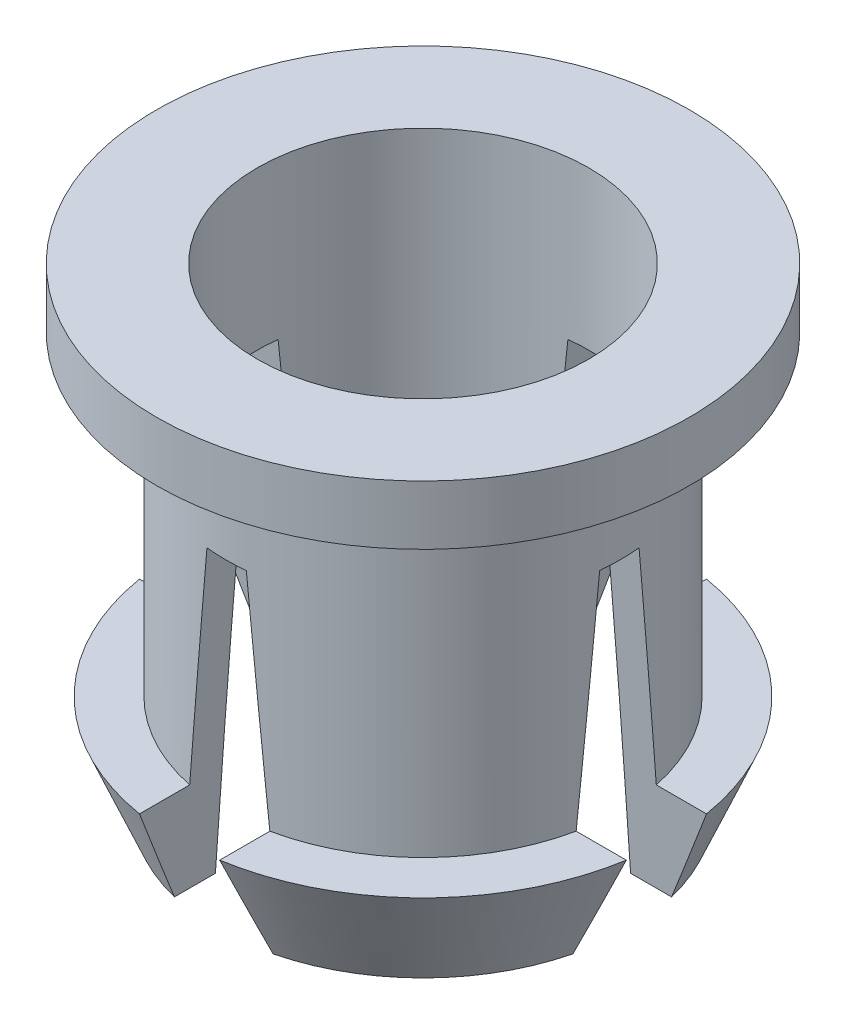
ISO-10303-21;
HEADER;
FILE_DESCRIPTION(('STEP AP214'),'2;1');
FILE_NAME('part.step','',(''),(''),'','','');
FILE_SCHEMA(('AUTOMOTIVE_DESIGN { 1 0 10303 214 1 1 1 1 }'));
ENDSEC;
DATA;
#1=APPLICATION_CONTEXT('core data for automotive mechanical design processes');
#2=APPLICATION_PROTOCOL_DEFINITION('international standard','automotive_design',2000,#1);
#3=PRODUCT_CONTEXT('',#1,'mechanical');
#4=PRODUCT('Part','Part','',(#3));
#5=PRODUCT_RELATED_PRODUCT_CATEGORY('part','',(#4));
#6=PRODUCT_DEFINITION_FORMATION('','',#4);
#7=PRODUCT_DEFINITION_CONTEXT('part definition',#1,'design');
#8=PRODUCT_DEFINITION('design','',#6,#7);
#9=PRODUCT_DEFINITION_SHAPE('','',#8);
#10=(LENGTH_UNIT() NAMED_UNIT(*) SI_UNIT(.MILLI.,.METRE.));
#11=(NAMED_UNIT(*) PLANE_ANGLE_UNIT() SI_UNIT($,.RADIAN.));
#12=(NAMED_UNIT(*) SI_UNIT($,.STERADIAN.) SOLID_ANGLE_UNIT());
#13=UNCERTAINTY_MEASURE_WITH_UNIT(LENGTH_MEASURE(1.E-05),#10,'distance_accuracy_value','');
#14=(GEOMETRIC_REPRESENTATION_CONTEXT(3) GLOBAL_UNCERTAINTY_ASSIGNED_CONTEXT((#13)) GLOBAL_UNIT_ASSIGNED_CONTEXT((#10,
#11,#12)) REPRESENTATION_CONTEXT('',''));
#15=CARTESIAN_POINT('',(0.,0.,0.));
#16=DIRECTION('',(0.,0.,1.));
#17=DIRECTION('',(1.,0.,0.));
#18=AXIS2_PLACEMENT_3D('',#15,#16,#17);
#19=CARTESIAN_POINT('',(2.1,-3.,0.));
#20=DIRECTION('',(0.,1.,0.));
#21=DIRECTION('',(0.,0.,1.));
#22=AXIS2_PLACEMENT_3D('',#19,#20,#21);
#23=PLANE('',#22);
#24=CARTESIAN_POINT('',(0.,-3.,0.));
#25=DIRECTION('',(0.,1.,0.));
#26=DIRECTION('',(0.,0.,1.));
#27=AXIS2_PLACEMENT_3D('',#24,#25,#26);
#28=CIRCLE('',#27,2.6);
#29=CARTESIAN_POINT('',(-2.52376207277944,-3.,0.625000000000009));
#30=VERTEX_POINT('',#29);
#31=CARTESIAN_POINT('',(-0.625,-3.,2.52376207277944));
#32=VERTEX_POINT('',#31);
#33=EDGE_CURVE('E220',#30,#32,#28,.T.);
#34=ORIENTED_EDGE('',*,*,#33,.F.);
#35=DIRECTION('',(1.,0.,0.));
#36=VECTOR('',#35,1.);
#37=CARTESIAN_POINT('',(-3.37500000000001,-3.,0.625000000000012));
#38=LINE('',#37,#36);
#39=CARTESIAN_POINT('',(-2.00483789868408,-3.,0.625000000000007));
#40=VERTEX_POINT('',#39);
#41=EDGE_CURVE('E489',#30,#40,#38,.T.);
#42=ORIENTED_EDGE('',*,*,#41,.T.);
#43=CARTESIAN_POINT('',(0.,-3.,0.));
#44=DIRECTION('',(0.,1.,0.));
#45=DIRECTION('',(0.,0.,1.));
#46=AXIS2_PLACEMENT_3D('',#43,#44,#45);
#47=CIRCLE('',#46,2.1);
#48=CARTESIAN_POINT('',(-0.625,-3.,2.00483789868408));
#49=VERTEX_POINT('',#48);
#50=EDGE_CURVE('E227',#40,#49,#47,.T.);
#51=ORIENTED_EDGE('',*,*,#50,.T.);
#52=DIRECTION('',(0.,0.,1.));
#53=VECTOR('',#52,1.);
#54=CARTESIAN_POINT('',(-0.625,-3.,-3.375));
#55=LINE('',#54,#53);
#56=EDGE_CURVE('E428',#49,#32,#55,.T.);
#57=ORIENTED_EDGE('',*,*,#56,.T.);
#58=EDGE_LOOP('',(#34,#42,#51,#57));
#59=FACE_BOUND('',#58,.T.);
#60=ADVANCED_FACE('F34',(#59),#23,.F.);
#61=CARTESIAN_POINT('',(0.,-3.,0.));
#62=DIRECTION('',(0.,1.,0.));
#63=DIRECTION('',(0.,0.,1.));
#64=AXIS2_PLACEMENT_3D('',#61,#62,#63);
#65=CONICAL_SURFACE('',#64,2.6,0.397627991522129);
#66=CARTESIAN_POINT('',(0.,-1.75,0.));
#67=DIRECTION('',(0.,1.,0.));
#68=DIRECTION('',(0.,0.,1.));
#69=AXIS2_PLACEMENT_3D('',#66,#67,#68);
#70=CIRCLE('',#69,3.125);
#71=CARTESIAN_POINT('',(-3.08348916969804,-1.75,0.507660851706013));
#72=VERTEX_POINT('',#71);
#73=CARTESIAN_POINT('',(-0.507660851706003,-1.75,3.08348916969804));
#74=VERTEX_POINT('',#73);
#75=EDGE_CURVE('E290',#72,#74,#70,.T.);
#76=ORIENTED_EDGE('',*,*,#75,.F.);
#77=CARTESIAN_POINT('',(-3.08357739132101,-1.7498,0.507642077442286));
#78=CARTESIAN_POINT('',(-3.03749931028814,-1.85425701063425,0.517447594771214));
#79=CARTESIAN_POINT('',(-2.99130333072685,-1.95866258349719,0.527248283568721));
#80=CARTESIAN_POINT('',(-2.89863670143563,-2.16735164706901,0.546838201150952));
#81=CARTESIAN_POINT('',(-2.85216605426808,-2.27163513890595,0.556627430041569));
#82=CARTESIAN_POINT('',(-2.75891024874476,-2.48006302847258,0.576192830875539));
#83=CARTESIAN_POINT('',(-2.71212508964057,-2.58420742587056,0.585969002787755));
#84=CARTESIAN_POINT('',(-2.61818697251316,-2.79233279292045,0.605506005434163));
#85=CARTESIAN_POINT('',(-2.57103401106228,-2.89631376103844,0.615266836024363));
#86=CARTESIAN_POINT('',(-2.52367088560967,-3.00019999999999,0.625018774263736));
#87=B_SPLINE_CURVE_WITH_KNOTS('',3,(#77,#78,#79,#80,#81,#82,#83,#84,#85,#86),.UNSPECIFIED.,.F.,
.F.,(4,2,2,2,4),(0.,0.343766631513928,0.687530061063177,1.03129430893586,1.37506176429571),.UNSPECIFIED.);
#88=EDGE_CURVE('E463',#72,#30,#87,.T.);
#89=ORIENTED_EDGE('',*,*,#88,.T.);
#90=ORIENTED_EDGE('',*,*,#33,.T.);
#91=CARTESIAN_POINT('',(-0.625018774263727,-3.0002,2.52367088560967));
#92=CARTESIAN_POINT('',(-0.615266836024355,-2.89631376103844,2.57103401106228));
#93=CARTESIAN_POINT('',(-0.605506005434154,-2.79233279292045,2.61818697251316));
#94=CARTESIAN_POINT('',(-0.585969002787746,-2.58420742587056,2.71212508964057));
#95=CARTESIAN_POINT('',(-0.57619283087553,-2.48006302847258,2.75891024874477));
#96=CARTESIAN_POINT('',(-0.556627430041559,-2.27163513890596,2.85216605426808));
#97=CARTESIAN_POINT('',(-0.546838201150942,-2.16735164706901,2.89863670143563));
#98=CARTESIAN_POINT('',(-0.527248283568711,-1.95866258349719,2.99130333072685));
#99=CARTESIAN_POINT('',(-0.517447594771203,-1.85425701063425,3.03749931028814));
#100=CARTESIAN_POINT('',(-0.507642077442275,-1.7498,3.08357739132101));
#101=B_SPLINE_CURVE_WITH_KNOTS('',3,(#91,#92,#93,#94,#95,#96,#97,#98,#99,#100),.UNSPECIFIED.,
.F.,.F.,(4,2,2,2,4),(0.,0.34376745535985,0.687531703232539,1.03129513278179,1.37506176429572),.UNSPECIFIED.);
#102=EDGE_CURVE('E318',#32,#74,#101,.T.);
#103=ORIENTED_EDGE('',*,*,#102,.T.);
#104=EDGE_LOOP('',(#76,#89,#90,#103));
#105=FACE_BOUND('',#104,.T.);
#106=ADVANCED_FACE('F356',(#105),#65,.T.);
#107=CARTESIAN_POINT('',(3.125,-1.75,0.));
#108=DIRECTION('',(0.,-1.,0.));
#109=DIRECTION('',(0.,0.,-1.));
#110=AXIS2_PLACEMENT_3D('',#107,#108,#109);
#111=PLANE('',#110);
#112=CARTESIAN_POINT('',(0.,-1.75,0.));
#113=DIRECTION('',(0.,1.,0.));
#114=DIRECTION('',(0.,0.,1.));
#115=AXIS2_PLACEMENT_3D('',#112,#113,#114);
#116=CIRCLE('',#115,2.5);
#117=CARTESIAN_POINT('',(-2.44791349104602,-1.75,0.507660851706011));
#118=VERTEX_POINT('',#117);
#119=CARTESIAN_POINT('',(-0.507660851706002,-1.75,2.44791349104602));
#120=VERTEX_POINT('',#119);
#121=EDGE_CURVE('E289',#118,#120,#116,.T.);
#122=ORIENTED_EDGE('',*,*,#121,.F.);
#123=DIRECTION('',(-1.,0.,0.));
#124=VECTOR('',#123,1.);
#125=CARTESIAN_POINT('',(3.125,-1.75,0.507660851705992));
#126=LINE('',#125,#124);
#127=EDGE_CURVE('E471',#118,#72,#126,.T.);
#128=ORIENTED_EDGE('',*,*,#127,.T.);
#129=ORIENTED_EDGE('',*,*,#75,.T.);
#130=DIRECTION('',(0.,0.,-1.));
#131=VECTOR('',#130,1.);
#132=CARTESIAN_POINT('',(-0.507660851706003,-1.75,0.));
#133=LINE('',#132,#131);
#134=EDGE_CURVE('E400',#74,#120,#133,.T.);
#135=ORIENTED_EDGE('',*,*,#134,.T.);
#136=EDGE_LOOP('',(#122,#128,#129,#135));
#137=FACE_BOUND('',#136,.T.);
#138=ADVANCED_FACE('F349',(#137),#111,.F.);
#139=CARTESIAN_POINT('',(0.625,-3.,2.00483789868408));
#140=VERTEX_POINT('',#139);
#141=CARTESIAN_POINT('',(2.00483789868408,-3.,0.624999999999993));
#142=VERTEX_POINT('',#141);
#143=EDGE_CURVE('E233',#140,#142,#47,.T.);
#144=ORIENTED_EDGE('',*,*,#143,.T.);
#145=CARTESIAN_POINT('',(2.52376207277945,-3.,0.624999999999991));
#146=VERTEX_POINT('',#145);
#147=EDGE_CURVE('E490',#142,#146,#38,.T.);
#148=ORIENTED_EDGE('',*,*,#147,.T.);
#149=CARTESIAN_POINT('',(0.625,-3.,2.52376207277945));
#150=VERTEX_POINT('',#149);
#151=EDGE_CURVE('E222',#150,#146,#28,.T.);
#152=ORIENTED_EDGE('',*,*,#151,.F.);
#153=DIRECTION('',(0.,0.,1.));
#154=VECTOR('',#153,1.);
#155=CARTESIAN_POINT('',(0.625,-3.,-3.375));
#156=LINE('',#155,#154);
#157=EDGE_CURVE('E432',#140,#150,#156,.T.);
#158=ORIENTED_EDGE('',*,*,#157,.F.);
#159=EDGE_LOOP('',(#144,#148,#152,#158));
#160=FACE_BOUND('',#159,.T.);
#161=ADVANCED_FACE('F358',(#160),#23,.F.);
#162=ORIENTED_EDGE('',*,*,#151,.T.);
#163=CARTESIAN_POINT('',(2.52367088560967,-3.00019999999999,0.625018774263718));
#164=CARTESIAN_POINT('',(2.57103401106228,-2.89631376103844,0.615266836024345));
#165=CARTESIAN_POINT('',(2.61818697251317,-2.79233279292045,0.605506005434145));
#166=CARTESIAN_POINT('',(2.71212508964057,-2.58420742587056,0.585969002787736));
#167=CARTESIAN_POINT('',(2.75891024874477,-2.48006302847258,0.57619283087552));
#168=CARTESIAN_POINT('',(2.85216605426809,-2.27163513890595,0.556627430041549));
#169=CARTESIAN_POINT('',(2.89863670143564,-2.16735164706901,0.546838201150932));
#170=CARTESIAN_POINT('',(2.99130333072686,-1.95866258349718,0.5272482835687));
#171=CARTESIAN_POINT('',(3.03749931028814,-1.85425701063425,0.517447594771193));
#172=CARTESIAN_POINT('',(3.08357739132101,-1.7498,0.507642077442265));
#173=B_SPLINE_CURVE_WITH_KNOTS('',3,(#163,#164,#165,#166,#167,#168,#169,#170,#171,#172),
.UNSPECIFIED.,.F.,.F.,(4,2,2,2,4),(0.,0.343767455359848,0.687531703232537,1.03129513278179,
1.37506176429571),.UNSPECIFIED.);
#174=CARTESIAN_POINT('',(3.08348916969805,-1.75,0.507660851705992));
#175=VERTEX_POINT('',#174);
#176=EDGE_CURVE('E444',#146,#175,#173,.T.);
#177=ORIENTED_EDGE('',*,*,#176,.T.);
#178=CARTESIAN_POINT('',(0.507660851706003,-1.75,3.08348916969804));
#179=VERTEX_POINT('',#178);
#180=EDGE_CURVE('E223',#179,#175,#70,.T.);
#181=ORIENTED_EDGE('',*,*,#180,.F.);
#182=CARTESIAN_POINT('',(0.507642077442275,-1.7498,3.08357739132101));
#183=CARTESIAN_POINT('',(0.517447594771203,-1.85425701063425,3.03749931028814));
#184=CARTESIAN_POINT('',(0.527248283568711,-1.95866258349719,2.99130333072685));
#185=CARTESIAN_POINT('',(0.546838201150942,-2.16735164706901,2.89863670143563));
#186=CARTESIAN_POINT('',(0.556627430041559,-2.27163513890596,2.85216605426809));
#187=CARTESIAN_POINT('',(0.57619283087553,-2.48006302847258,2.75891024874477));
#188=CARTESIAN_POINT('',(0.585969002787746,-2.58420742587056,2.71212508964057));
#189=CARTESIAN_POINT('',(0.605506005434155,-2.79233279292046,2.61818697251316));
#190=CARTESIAN_POINT('',(0.615266836024355,-2.89631376103844,2.57103401106228));
#191=CARTESIAN_POINT('',(0.625018774263727,-3.0002,2.52367088560967));
#192=B_SPLINE_CURVE_WITH_KNOTS('',3,(#182,#183,#184,#185,#186,#187,#188,#189,#190,#191),
.UNSPECIFIED.,.F.,.F.,(4,2,2,2,4),(0.,0.343766631513929,0.687530061063181,1.03129430893587,
1.37506176429572),.UNSPECIFIED.);
#193=EDGE_CURVE('E415',#179,#150,#192,.T.);
#194=ORIENTED_EDGE('',*,*,#193,.T.);
#195=EDGE_LOOP('',(#162,#177,#181,#194));
#196=FACE_BOUND('',#195,.T.);
#197=ADVANCED_FACE('F368',(#196),#65,.T.);
#198=ORIENTED_EDGE('',*,*,#180,.T.);
#199=DIRECTION('',(-1.,0.,0.));
#200=VECTOR('',#199,1.);
#201=CARTESIAN_POINT('',(3.125,-1.75,0.507660851705992));
#202=LINE('',#201,#200);
#203=CARTESIAN_POINT('',(2.44791349104603,-1.75,0.507660851705994));
#204=VERTEX_POINT('',#203);
#205=EDGE_CURVE('E393',#175,#204,#202,.T.);
#206=ORIENTED_EDGE('',*,*,#205,.T.);
#207=CARTESIAN_POINT('',(0.507660851706003,-1.75,2.44791349104602));
#208=VERTEX_POINT('',#207);
#209=EDGE_CURVE('E286',#208,#204,#116,.T.);
#210=ORIENTED_EDGE('',*,*,#209,.F.);
#211=DIRECTION('',(0.,0.,1.));
#212=VECTOR('',#211,1.);
#213=CARTESIAN_POINT('',(0.507660851706003,-1.75,0.));
#214=LINE('',#213,#212);
#215=EDGE_CURVE('E394',#208,#179,#214,.T.);
#216=ORIENTED_EDGE('',*,*,#215,.T.);
#217=EDGE_LOOP('',(#198,#206,#210,#216));
#218=FACE_BOUND('',#217,.T.);
#219=ADVANCED_FACE('F360',(#218),#111,.F.);
#220=CARTESIAN_POINT('',(-0.625,-3.,-2.00483789868408));
#221=VERTEX_POINT('',#220);
#222=CARTESIAN_POINT('',(-2.00483789868408,-3.,-0.624999999999993));
#223=VERTEX_POINT('',#222);
#224=EDGE_CURVE('E213',#221,#223,#47,.T.);
#225=ORIENTED_EDGE('',*,*,#224,.T.);
#226=DIRECTION('',(1.,0.,0.));
#227=VECTOR('',#226,1.);
#228=CARTESIAN_POINT('',(-3.37500000000001,-3.,-0.624999999999988));
#229=LINE('',#228,#227);
#230=CARTESIAN_POINT('',(-2.52376207277945,-3.,-0.624999999999991));
#231=VERTEX_POINT('',#230);
#232=EDGE_CURVE('E196',#231,#223,#229,.T.);
#233=ORIENTED_EDGE('',*,*,#232,.F.);
#234=CARTESIAN_POINT('',(-0.625,-3.,-2.52376207277944));
#235=VERTEX_POINT('',#234);
#236=EDGE_CURVE('E211',#235,#231,#28,.T.);
#237=ORIENTED_EDGE('',*,*,#236,.F.);
#238=EDGE_CURVE('E430',#235,#221,#55,.T.);
#239=ORIENTED_EDGE('',*,*,#238,.T.);
#240=EDGE_LOOP('',(#225,#233,#237,#239));
#241=FACE_BOUND('',#240,.T.);
#242=ADVANCED_FACE('F209',(#241),#23,.F.);
#243=ORIENTED_EDGE('',*,*,#236,.T.);
#244=CARTESIAN_POINT('',(-2.52367088560967,-3.00019999999999,-0.625018774263718));
#245=CARTESIAN_POINT('',(-2.57103401106228,-2.89631376103844,-0.615266836024345));
#246=CARTESIAN_POINT('',(-2.61818697251316,-2.79233279292045,-0.605506005434145));
#247=CARTESIAN_POINT('',(-2.71212508964057,-2.58420742587056,-0.585969002787736));
#248=CARTESIAN_POINT('',(-2.75891024874477,-2.48006302847258,-0.57619283087552));
#249=CARTESIAN_POINT('',(-2.85216605426809,-2.27163513890595,-0.556627430041549));
#250=CARTESIAN_POINT('',(-2.89863670143563,-2.16735164706901,-0.546838201150932));
#251=CARTESIAN_POINT('',(-2.99130333072686,-1.95866258349718,-0.5272482835687));
#252=CARTESIAN_POINT('',(-3.03749931028814,-1.85425701063425,-0.517447594771193));
#253=CARTESIAN_POINT('',(-3.08357739132101,-1.7498,-0.507642077442265));
#254=B_SPLINE_CURVE_WITH_KNOTS('',3,(#244,#245,#246,#247,#248,#249,#250,#251,#252,#253),
.UNSPECIFIED.,.F.,.F.,(4,2,2,2,4),(0.,0.343767455359849,0.687531703232536,1.03129513278179,
1.37506176429571),.UNSPECIFIED.);
#255=CARTESIAN_POINT('',(-3.08348916969805,-1.75,-0.507660851705992));
#256=VERTEX_POINT('',#255);
#257=EDGE_CURVE('E193',#231,#256,#254,.T.);
#258=ORIENTED_EDGE('',*,*,#257,.T.);
#259=CARTESIAN_POINT('',(-0.507660851706003,-1.75,-3.08348916969804));
#260=VERTEX_POINT('',#259);
#261=EDGE_CURVE('E396',#260,#256,#70,.T.);
#262=ORIENTED_EDGE('',*,*,#261,.F.);
#263=CARTESIAN_POINT('',(-0.507642077442275,-1.7498,-3.08357739132101));
#264=CARTESIAN_POINT('',(-0.517447594771203,-1.85425701063425,-3.03749931028814));
#265=CARTESIAN_POINT('',(-0.52724828356871,-1.95866258349719,-2.99130333072685));
#266=CARTESIAN_POINT('',(-0.546838201150942,-2.16735164706901,-2.89863670143563));
#267=CARTESIAN_POINT('',(-0.556627430041559,-2.27163513890595,-2.85216605426808));
#268=CARTESIAN_POINT('',(-0.57619283087553,-2.48006302847258,-2.75891024874477));
#269=CARTESIAN_POINT('',(-0.585969002787746,-2.58420742587056,-2.71212508964057));
#270=CARTESIAN_POINT('',(-0.605506005434154,-2.79233279292045,-2.61818697251316));
#271=CARTESIAN_POINT('',(-0.615266836024355,-2.89631376103844,-2.57103401106228));
#272=CARTESIAN_POINT('',(-0.625018774263727,-3.0002,-2.52367088560967));
#273=B_SPLINE_CURVE_WITH_KNOTS('',3,(#263,#264,#265,#266,#267,#268,#269,#270,#271,#272),
.UNSPECIFIED.,.F.,.F.,(4,2,2,2,4),(0.,0.343766631513929,0.68753006106318,1.03129430893587,
1.37506176429572),.UNSPECIFIED.);
#274=EDGE_CURVE('E218',#260,#235,#273,.T.);
#275=ORIENTED_EDGE('',*,*,#274,.T.);
#276=EDGE_LOOP('',(#243,#258,#262,#275));
#277=FACE_BOUND('',#276,.T.);
#278=ADVANCED_FACE('F217',(#277),#65,.T.);
#279=ORIENTED_EDGE('',*,*,#261,.T.);
#280=DIRECTION('',(1.,0.,0.));
#281=VECTOR('',#280,1.);
#282=CARTESIAN_POINT('',(3.125,-1.75,-0.507660851706013));
#283=LINE('',#282,#281);
#284=CARTESIAN_POINT('',(-2.44791349104603,-1.75,-0.507660851705994));
#285=VERTEX_POINT('',#284);
#286=EDGE_CURVE('E199',#256,#285,#283,.T.);
#287=ORIENTED_EDGE('',*,*,#286,.T.);
#288=CARTESIAN_POINT('',(-0.507660851706002,-1.75,-2.44791349104602));
#289=VERTEX_POINT('',#288);
#290=EDGE_CURVE('E287',#289,#285,#116,.T.);
#291=ORIENTED_EDGE('',*,*,#290,.F.);
#292=EDGE_CURVE('E317',#289,#260,#133,.T.);
#293=ORIENTED_EDGE('',*,*,#292,.T.);
#294=EDGE_LOOP('',(#279,#287,#291,#293));
#295=FACE_BOUND('',#294,.T.);
#296=ADVANCED_FACE('F350',(#295),#111,.F.);
#297=CARTESIAN_POINT('',(3.375,3.,0.));
#298=DIRECTION('',(0.,-1.,0.));
#299=DIRECTION('',(0.,0.,-1.));
#300=AXIS2_PLACEMENT_3D('',#297,#298,#299);
#301=PLANE('',#300);
#302=CARTESIAN_POINT('',(0.,3.,0.));
#303=DIRECTION('',(0.,1.,0.));
#304=DIRECTION('',(0.,0.,1.));
#305=AXIS2_PLACEMENT_3D('',#302,#303,#304);
#306=CIRCLE('',#305,2.1);
#307=CARTESIAN_POINT('',(0.,3.,2.1));
#308=VERTEX_POINT('',#307);
#309=EDGE_CURVE('E241',#308,#308,#306,.T.);
#310=ORIENTED_EDGE('',*,*,#309,.F.);
#311=EDGE_LOOP('',(#310));
#312=FACE_BOUND('',#311,.T.);
#313=CARTESIAN_POINT('',(0.,3.,0.));
#314=DIRECTION('',(0.,1.,0.));
#315=DIRECTION('',(0.,0.,1.));
#316=AXIS2_PLACEMENT_3D('',#313,#314,#315);
#317=CIRCLE('',#316,3.375);
#318=CARTESIAN_POINT('',(0.,3.,3.375));
#319=VERTEX_POINT('',#318);
#320=EDGE_CURVE('E302',#319,#319,#317,.T.);
#321=ORIENTED_EDGE('',*,*,#320,.T.);
#322=EDGE_LOOP('',(#321));
#323=FACE_BOUND('',#322,.T.);
#324=ADVANCED_FACE('F36',(#312,#323),#301,.F.);
#325=CARTESIAN_POINT('',(0.,3.,0.));
#326=DIRECTION('',(0.,1.,0.));
#327=DIRECTION('',(0.,0.,1.));
#328=AXIS2_PLACEMENT_3D('',#325,#326,#327);
#329=CYLINDRICAL_SURFACE('',#328,2.1);
#330=CARTESIAN_POINT('',(0.,1.,0.));
#331=DIRECTION('',(0.,1.,0.));
#332=DIRECTION('',(0.,0.,1.));
#333=AXIS2_PLACEMENT_3D('',#330,#331,#332);
#334=CIRCLE('',#333,2.1);
#335=CARTESIAN_POINT('',(2.08512407347357,1.,-0.249514725459215));
#336=VERTEX_POINT('',#335);
#337=CARTESIAN_POINT('',(2.08512407347357,1.,0.2495147254592));
#338=VERTEX_POINT('',#337);
#339=EDGE_CURVE('E485',#336,#338,#334,.F.);
#340=ORIENTED_EDGE('',*,*,#339,.T.);
#341=CARTESIAN_POINT('',(0.,3.65805071332671,0.));
#342=DIRECTION('',(0.,0.0934604432801498,0.995622993678771));
#343=DIRECTION('',(0.,0.995622993678771,-0.0934604432801498));
#344=AXIS2_PLACEMENT_3D('',#341,#342,#343);
#345=ELLIPSE('',#344,22.4693990986668,2.1);
#346=EDGE_CURVE('E431',#338,#142,#345,.F.);
#347=ORIENTED_EDGE('',*,*,#346,.T.);
#348=ORIENTED_EDGE('',*,*,#143,.F.);
#349=CARTESIAN_POINT('',(0.,3.65805071332671,0.));
#350=DIRECTION('',(0.995622993678771,0.0934604432801498,0.));
#351=DIRECTION('',(-0.0934604432801498,0.995622993678771,0.));
#352=AXIS2_PLACEMENT_3D('',#349,#350,#351);
#353=ELLIPSE('',#352,22.4693990986668,2.1);
#354=CARTESIAN_POINT('',(0.249514725459208,1.,2.08512407347357));
#355=VERTEX_POINT('',#354);
#356=EDGE_CURVE('E412',#140,#355,#353,.F.);
#357=ORIENTED_EDGE('',*,*,#356,.T.);
#358=CARTESIAN_POINT('',(0.,1.,0.));
#359=DIRECTION('',(0.,1.,0.));
#360=DIRECTION('',(0.,0.,1.));
#361=AXIS2_PLACEMENT_3D('',#358,#359,#360);
#362=CIRCLE('',#361,2.1);
#363=CARTESIAN_POINT('',(-0.249514725459208,1.,2.08512407347357));
#364=VERTEX_POINT('',#363);
#365=EDGE_CURVE('E407',#355,#364,#362,.F.);
#366=ORIENTED_EDGE('',*,*,#365,.T.);
#367=CARTESIAN_POINT('',(0.,3.65805071332672,0.));
#368=DIRECTION('',(-0.995622993678771,0.0934604432801498,0.));
#369=DIRECTION('',(0.0934604432801498,0.995622993678771,0.));
#370=AXIS2_PLACEMENT_3D('',#367,#368,#369);
#371=ELLIPSE('',#370,22.4693990986668,2.1);
#372=EDGE_CURVE('E307',#364,#49,#371,.F.);
#373=ORIENTED_EDGE('',*,*,#372,.T.);
#374=ORIENTED_EDGE('',*,*,#50,.F.);
#375=CARTESIAN_POINT('',(0.,3.65805071332671,0.));
#376=DIRECTION('',(0.,0.0934604432801498,0.995622993678771));
#377=DIRECTION('',(0.,0.995622993678771,-0.0934604432801498));
#378=AXIS2_PLACEMENT_3D('',#375,#376,#377);
#379=ELLIPSE('',#378,22.4693990986668,2.1);
#380=CARTESIAN_POINT('',(-2.08512407347357,1.,0.249514725459215));
#381=VERTEX_POINT('',#380);
#382=EDGE_CURVE('E470',#40,#381,#379,.F.);
#383=ORIENTED_EDGE('',*,*,#382,.T.);
#384=CARTESIAN_POINT('',(-2.08512407347357,1.,-0.2495147254592));
#385=VERTEX_POINT('',#384);
#386=EDGE_CURVE('E497',#381,#385,#334,.F.);
#387=ORIENTED_EDGE('',*,*,#386,.T.);
#388=CARTESIAN_POINT('',(0.,3.65805071332671,0.));
#389=DIRECTION('',(0.,0.0934604432801498,-0.995622993678771));
#390=DIRECTION('',(0.,0.995622993678771,0.0934604432801498));
#391=AXIS2_PLACEMENT_3D('',#388,#389,#390);
#392=ELLIPSE('',#391,22.4693990986668,2.1);
#393=EDGE_CURVE('E204',#385,#223,#392,.F.);
#394=ORIENTED_EDGE('',*,*,#393,.T.);
#395=ORIENTED_EDGE('',*,*,#224,.F.);
#396=CARTESIAN_POINT('',(-0.249514725459208,1.,-2.08512407347357));
#397=VERTEX_POINT('',#396);
#398=EDGE_CURVE('E308',#221,#397,#371,.F.);
#399=ORIENTED_EDGE('',*,*,#398,.T.);
#400=CARTESIAN_POINT('',(0.249514725459208,1.,-2.08512407347357));
#401=VERTEX_POINT('',#400);
#402=EDGE_CURVE('E404',#397,#401,#362,.F.);
#403=ORIENTED_EDGE('',*,*,#402,.T.);
#404=CARTESIAN_POINT('',(0.625,-3.,-2.00483789868408));
#405=VERTEX_POINT('',#404);
#406=EDGE_CURVE('E410',#401,#405,#353,.F.);
#407=ORIENTED_EDGE('',*,*,#406,.T.);
#408=CARTESIAN_POINT('',(2.00483789868408,-3.,-0.625000000000007));
#409=VERTEX_POINT('',#408);
#410=EDGE_CURVE('E232',#409,#405,#47,.T.);
#411=ORIENTED_EDGE('',*,*,#410,.F.);
#412=CARTESIAN_POINT('',(0.,3.65805071332671,0.));
#413=DIRECTION('',(0.,0.0934604432801498,-0.995622993678771));
#414=DIRECTION('',(0.,0.995622993678771,0.0934604432801498));
#415=AXIS2_PLACEMENT_3D('',#412,#413,#414);
#416=ELLIPSE('',#415,22.4693990986668,2.1);
#417=EDGE_CURVE('E481',#409,#336,#416,.F.);
#418=ORIENTED_EDGE('',*,*,#417,.T.);
#419=EDGE_LOOP('',(#340,#347,#348,#357,#366,#373,#374,#383,#387,#394,#395,#399,#403,#407,#411,#418));
#420=FACE_BOUND('',#419,.T.);
#421=ORIENTED_EDGE('',*,*,#309,.T.);
#422=EDGE_LOOP('',(#421));
#423=FACE_BOUND('',#422,.T.);
#424=ADVANCED_FACE('F372',(#420,#423),#329,.F.);
#425=CARTESIAN_POINT('',(2.52376207277944,-3.,-0.625000000000009));
#426=VERTEX_POINT('',#425);
#427=CARTESIAN_POINT('',(0.625,-3.,-2.52376207277945));
#428=VERTEX_POINT('',#427);
#429=EDGE_CURVE('E219',#426,#428,#28,.T.);
#430=ORIENTED_EDGE('',*,*,#429,.F.);
#431=EDGE_CURVE('E214',#409,#426,#229,.T.);
#432=ORIENTED_EDGE('',*,*,#431,.F.);
#433=ORIENTED_EDGE('',*,*,#410,.T.);
#434=EDGE_CURVE('E434',#428,#405,#156,.T.);
#435=ORIENTED_EDGE('',*,*,#434,.F.);
#436=EDGE_LOOP('',(#430,#432,#433,#435));
#437=FACE_BOUND('',#436,.T.);
#438=ADVANCED_FACE('F354',(#437),#23,.F.);
#439=CARTESIAN_POINT('',(3.08348916969804,-1.75,-0.507660851706013));
#440=VERTEX_POINT('',#439);
#441=CARTESIAN_POINT('',(0.507660851706003,-1.75,-3.08348916969804));
#442=VERTEX_POINT('',#441);
#443=EDGE_CURVE('E395',#440,#442,#70,.T.);
#444=ORIENTED_EDGE('',*,*,#443,.F.);
#445=CARTESIAN_POINT('',(3.08357739132101,-1.7498,-0.507642077442286));
#446=CARTESIAN_POINT('',(3.03749931028814,-1.85425701063425,-0.517447594771214));
#447=CARTESIAN_POINT('',(2.99130333072685,-1.95866258349719,-0.527248283568721));
#448=CARTESIAN_POINT('',(2.89863670143563,-2.16735164706901,-0.546838201150952));
#449=CARTESIAN_POINT('',(2.85216605426808,-2.27163513890595,-0.556627430041569));
#450=CARTESIAN_POINT('',(2.75891024874477,-2.48006302847258,-0.576192830875539));
#451=CARTESIAN_POINT('',(2.71212508964057,-2.58420742587056,-0.585969002787755));
#452=CARTESIAN_POINT('',(2.61818697251316,-2.79233279292045,-0.605506005434163));
#453=CARTESIAN_POINT('',(2.57103401106228,-2.89631376103844,-0.615266836024363));
#454=CARTESIAN_POINT('',(2.52367088560967,-3.0002,-0.625018774263736));
#455=B_SPLINE_CURVE_WITH_KNOTS('',3,(#445,#446,#447,#448,#449,#450,#451,#452,#453,#454),
.UNSPECIFIED.,.F.,.F.,(4,2,2,2,4),(0.,0.343766631513928,0.687530061063177,1.03129430893587,
1.37506176429571),.UNSPECIFIED.);
#456=EDGE_CURVE('E476',#440,#426,#455,.T.);
#457=ORIENTED_EDGE('',*,*,#456,.T.);
#458=ORIENTED_EDGE('',*,*,#429,.T.);
#459=CARTESIAN_POINT('',(0.625018774263727,-3.0002,-2.52367088560967));
#460=CARTESIAN_POINT('',(0.615266836024355,-2.89631376103844,-2.57103401106228));
#461=CARTESIAN_POINT('',(0.605506005434155,-2.79233279292045,-2.61818697251316));
#462=CARTESIAN_POINT('',(0.585969002787746,-2.58420742587056,-2.71212508964057));
#463=CARTESIAN_POINT('',(0.57619283087553,-2.48006302847258,-2.75891024874477));
#464=CARTESIAN_POINT('',(0.556627430041559,-2.27163513890596,-2.85216605426809));
#465=CARTESIAN_POINT('',(0.546838201150942,-2.16735164706901,-2.89863670143563));
#466=CARTESIAN_POINT('',(0.527248283568711,-1.95866258349719,-2.99130333072685));
#467=CARTESIAN_POINT('',(0.517447594771203,-1.85425701063425,-3.03749931028814));
#468=CARTESIAN_POINT('',(0.507642077442276,-1.7498,-3.08357739132101));
#469=B_SPLINE_CURVE_WITH_KNOTS('',3,(#459,#460,#461,#462,#463,#464,#465,#466,#467,#468),
.UNSPECIFIED.,.F.,.F.,(4,2,2,2,4),(0.,0.343767455359851,0.68753170323254,1.03129513278179,
1.37506176429572),.UNSPECIFIED.);
#470=EDGE_CURVE('E420',#428,#442,#469,.T.);
#471=ORIENTED_EDGE('',*,*,#470,.T.);
#472=EDGE_LOOP('',(#444,#457,#458,#471));
#473=FACE_BOUND('',#472,.T.);
#474=ADVANCED_FACE('F323',(#473),#65,.T.);
#475=CARTESIAN_POINT('',(2.44791349104602,-1.75,-0.507660851706011));
#476=VERTEX_POINT('',#475);
#477=CARTESIAN_POINT('',(0.507660851706003,-1.75,-2.44791349104602));
#478=VERTEX_POINT('',#477);
#479=EDGE_CURVE('E274',#476,#478,#116,.T.);
#480=ORIENTED_EDGE('',*,*,#479,.F.);
#481=DIRECTION('',(1.,0.,0.));
#482=VECTOR('',#481,1.);
#483=CARTESIAN_POINT('',(3.125,-1.75,-0.507660851706013));
#484=LINE('',#483,#482);
#485=EDGE_CURVE('E282',#476,#440,#484,.T.);
#486=ORIENTED_EDGE('',*,*,#485,.T.);
#487=ORIENTED_EDGE('',*,*,#443,.T.);
#488=EDGE_CURVE('E285',#442,#478,#214,.T.);
#489=ORIENTED_EDGE('',*,*,#488,.T.);
#490=EDGE_LOOP('',(#480,#486,#487,#489));
#491=FACE_BOUND('',#490,.T.);
#492=ADVANCED_FACE('F281',(#491),#111,.F.);
#493=CARTESIAN_POINT('',(0.,3.,0.));
#494=DIRECTION('',(0.,1.,0.));
#495=DIRECTION('',(0.,0.,1.));
#496=AXIS2_PLACEMENT_3D('',#493,#494,#495);
#497=CYLINDRICAL_SURFACE('',#496,2.5);
#498=ORIENTED_EDGE('',*,*,#209,.T.);
#499=CARTESIAN_POINT('',(0.,3.65805071332671,0.));
#500=DIRECTION('',(0.,0.0934604432801498,0.995622993678771));
#501=DIRECTION('',(0.,0.995622993678771,-0.0934604432801498));
#502=AXIS2_PLACEMENT_3D('',#499,#500,#501);
#503=ELLIPSE('',#502,26.74928464127,2.5);
#504=CARTESIAN_POINT('',(2.48751731688023,1.,0.249514725459199));
#505=VERTEX_POINT('',#504);
#506=EDGE_CURVE('E11',#204,#505,#503,.T.);
#507=ORIENTED_EDGE('',*,*,#506,.T.);
#508=CARTESIAN_POINT('',(0.,1.,0.));
#509=DIRECTION('',(0.,1.,0.));
#510=DIRECTION('',(0.,0.,1.));
#511=AXIS2_PLACEMENT_3D('',#508,#509,#510);
#512=CIRCLE('',#511,2.5);
#513=CARTESIAN_POINT('',(2.48751731688023,1.,-0.249514725459216));
#514=VERTEX_POINT('',#513);
#515=EDGE_CURVE('E276',#505,#514,#512,.T.);
#516=ORIENTED_EDGE('',*,*,#515,.T.);
#517=CARTESIAN_POINT('',(0.,3.65805071332671,0.));
#518=DIRECTION('',(0.,0.0934604432801498,-0.995622993678771));
#519=DIRECTION('',(0.,0.995622993678771,0.0934604432801498));
#520=AXIS2_PLACEMENT_3D('',#517,#518,#519);
#521=ELLIPSE('',#520,26.74928464127,2.5);
#522=EDGE_CURVE('E42',#514,#476,#521,.T.);
#523=ORIENTED_EDGE('',*,*,#522,.T.);
#524=ORIENTED_EDGE('',*,*,#479,.T.);
#525=CARTESIAN_POINT('',(0.,3.65805071332671,0.));
#526=DIRECTION('',(0.995622993678771,0.0934604432801498,0.));
#527=DIRECTION('',(-0.0934604432801498,0.995622993678771,0.));
#528=AXIS2_PLACEMENT_3D('',#525,#526,#527);
#529=ELLIPSE('',#528,26.74928464127,2.5);
#530=CARTESIAN_POINT('',(0.249514725459208,1.,-2.48751731688023));
#531=VERTEX_POINT('',#530);
#532=EDGE_CURVE('E247',#478,#531,#529,.T.);
#533=ORIENTED_EDGE('',*,*,#532,.T.);
#534=CARTESIAN_POINT('',(0.,1.,0.));
#535=DIRECTION('',(0.,1.,0.));
#536=DIRECTION('',(0.,0.,1.));
#537=AXIS2_PLACEMENT_3D('',#534,#535,#536);
#538=CIRCLE('',#537,2.5);
#539=CARTESIAN_POINT('',(-0.249514725459208,1.,-2.48751731688023));
#540=VERTEX_POINT('',#539);
#541=EDGE_CURVE('E251',#531,#540,#538,.T.);
#542=ORIENTED_EDGE('',*,*,#541,.T.);
#543=CARTESIAN_POINT('',(0.,3.65805071332672,0.));
#544=DIRECTION('',(-0.995622993678771,0.0934604432801498,0.));
#545=DIRECTION('',(0.0934604432801498,0.995622993678771,0.));
#546=AXIS2_PLACEMENT_3D('',#543,#544,#545);
#547=ELLIPSE('',#546,26.74928464127,2.5);
#548=EDGE_CURVE('E257',#540,#289,#547,.T.);
#549=ORIENTED_EDGE('',*,*,#548,.T.);
#550=ORIENTED_EDGE('',*,*,#290,.T.);
#551=CARTESIAN_POINT('',(0.,3.65805071332671,0.));
#552=DIRECTION('',(0.,0.0934604432801498,-0.995622993678771));
#553=DIRECTION('',(0.,0.995622993678771,0.0934604432801498));
#554=AXIS2_PLACEMENT_3D('',#551,#552,#553);
#555=ELLIPSE('',#554,26.74928464127,2.5);
#556=CARTESIAN_POINT('',(-2.48751731688023,1.,-0.249514725459199));
#557=VERTEX_POINT('',#556);
#558=EDGE_CURVE('E262',#285,#557,#555,.T.);
#559=ORIENTED_EDGE('',*,*,#558,.T.);
#560=CARTESIAN_POINT('',(-2.48751731688023,1.,0.249514725459216));
#561=VERTEX_POINT('',#560);
#562=EDGE_CURVE('E496',#557,#561,#512,.T.);
#563=ORIENTED_EDGE('',*,*,#562,.T.);
#564=CARTESIAN_POINT('',(0.,3.65805071332671,0.));
#565=DIRECTION('',(0.,0.0934604432801498,0.995622993678771));
#566=DIRECTION('',(0.,0.995622993678771,-0.0934604432801498));
#567=AXIS2_PLACEMENT_3D('',#564,#565,#566);
#568=ELLIPSE('',#567,26.74928464127,2.5);
#569=EDGE_CURVE('E265',#561,#118,#568,.T.);
#570=ORIENTED_EDGE('',*,*,#569,.T.);
#571=ORIENTED_EDGE('',*,*,#121,.T.);
#572=CARTESIAN_POINT('',(-0.249514725459208,1.,2.48751731688023));
#573=VERTEX_POINT('',#572);
#574=EDGE_CURVE('E261',#120,#573,#547,.T.);
#575=ORIENTED_EDGE('',*,*,#574,.T.);
#576=CARTESIAN_POINT('',(0.249514725459208,1.,2.48751731688023));
#577=VERTEX_POINT('',#576);
#578=EDGE_CURVE('E258',#573,#577,#538,.T.);
#579=ORIENTED_EDGE('',*,*,#578,.T.);
#580=EDGE_CURVE('E253',#577,#208,#529,.T.);
#581=ORIENTED_EDGE('',*,*,#580,.T.);
#582=EDGE_LOOP('',(#498,#507,#516,#523,#524,#533,#542,#549,#550,#559,#563,#570,#571,#575,#579,#581));
#583=FACE_BOUND('',#582,.T.);
#584=CARTESIAN_POINT('',(0.,2.25,0.));
#585=DIRECTION('',(0.,1.,0.));
#586=DIRECTION('',(0.,0.,1.));
#587=AXIS2_PLACEMENT_3D('',#584,#585,#586);
#588=CIRCLE('',#587,2.5);
#589=CARTESIAN_POINT('',(0.,2.25,2.5));
#590=VERTEX_POINT('',#589);
#591=EDGE_CURVE('E293',#590,#590,#588,.T.);
#592=ORIENTED_EDGE('',*,*,#591,.F.);
#593=EDGE_LOOP('',(#592));
#594=FACE_BOUND('',#593,.T.);
#595=ADVANCED_FACE('F272',(#583,#594),#497,.T.);
#596=CARTESIAN_POINT('',(2.5,2.25,0.));
#597=DIRECTION('',(0.,1.,0.));
#598=DIRECTION('',(0.,0.,1.));
#599=AXIS2_PLACEMENT_3D('',#596,#597,#598);
#600=PLANE('',#599);
#601=CARTESIAN_POINT('',(0.,2.25,0.));
#602=DIRECTION('',(0.,1.,0.));
#603=DIRECTION('',(0.,0.,1.));
#604=AXIS2_PLACEMENT_3D('',#601,#602,#603);
#605=CIRCLE('',#604,3.375);
#606=CARTESIAN_POINT('',(0.,2.25,3.375));
#607=VERTEX_POINT('',#606);
#608=EDGE_CURVE('E298',#607,#607,#605,.T.);
#609=ORIENTED_EDGE('',*,*,#608,.F.);
#610=EDGE_LOOP('',(#609));
#611=FACE_BOUND('',#610,.T.);
#612=ORIENTED_EDGE('',*,*,#591,.T.);
#613=EDGE_LOOP('',(#612));
#614=FACE_BOUND('',#613,.T.);
#615=ADVANCED_FACE('F342',(#611,#614),#600,.F.);
#616=CARTESIAN_POINT('',(0.,3.,0.));
#617=DIRECTION('',(0.,1.,0.));
#618=DIRECTION('',(0.,0.,1.));
#619=AXIS2_PLACEMENT_3D('',#616,#617,#618);
#620=CYLINDRICAL_SURFACE('',#619,3.375);
#621=ORIENTED_EDGE('',*,*,#320,.F.);
#622=EDGE_LOOP('',(#621));
#623=FACE_BOUND('',#622,.T.);
#624=ORIENTED_EDGE('',*,*,#608,.T.);
#625=EDGE_LOOP('',(#624));
#626=FACE_BOUND('',#625,.T.);
#627=ADVANCED_FACE('F338',(#623,#626),#620,.T.);
#628=CARTESIAN_POINT('',(0.249514725459208,1.,-3.375));
#629=DIRECTION('',(0.995622993678771,0.0934604432801498,0.));
#630=DIRECTION('',(-0.0934604432801498,0.995622993678771,0.));
#631=AXIS2_PLACEMENT_3D('',#628,#629,#630);
#632=PLANE('',#631);
#633=DIRECTION('',(0.,0.,1.));
#634=VECTOR('',#633,1.);
#635=CARTESIAN_POINT('',(0.249514725459208,1.,-3.375));
#636=LINE('',#635,#634);
#637=EDGE_CURVE('E438',#531,#401,#636,.T.);
#638=ORIENTED_EDGE('',*,*,#637,.F.);
#639=ORIENTED_EDGE('',*,*,#532,.F.);
#640=ORIENTED_EDGE('',*,*,#488,.F.);
#641=ORIENTED_EDGE('',*,*,#470,.F.);
#642=ORIENTED_EDGE('',*,*,#434,.T.);
#643=ORIENTED_EDGE('',*,*,#406,.F.);
#644=EDGE_LOOP('',(#638,#639,#640,#641,#642,#643));
#645=FACE_BOUND('',#644,.T.);
#646=ADVANCED_FACE('F335',(#645),#632,.F.);
#647=CARTESIAN_POINT('',(-0.249514725459208,1.,-3.375));
#648=DIRECTION('',(0.,1.,0.));
#649=DIRECTION('',(0.,0.,1.));
#650=AXIS2_PLACEMENT_3D('',#647,#648,#649);
#651=PLANE('',#650);
#652=DIRECTION('',(0.,0.,1.));
#653=VECTOR('',#652,1.);
#654=CARTESIAN_POINT('',(-0.249514725459208,1.,-3.375));
#655=LINE('',#654,#653);
#656=EDGE_CURVE('E427',#540,#397,#655,.T.);
#657=ORIENTED_EDGE('',*,*,#656,.F.);
#658=ORIENTED_EDGE('',*,*,#541,.F.);
#659=ORIENTED_EDGE('',*,*,#637,.T.);
#660=ORIENTED_EDGE('',*,*,#402,.F.);
#661=EDGE_LOOP('',(#657,#658,#659,#660));
#662=FACE_BOUND('',#661,.T.);
#663=ADVANCED_FACE('F460',(#662),#651,.F.);
#664=CARTESIAN_POINT('',(-0.625,-3.,-3.375));
#665=DIRECTION('',(-0.995622993678771,0.0934604432801498,0.));
#666=DIRECTION('',(-0.0934604432801498,-0.995622993678771,0.));
#667=AXIS2_PLACEMENT_3D('',#664,#665,#666);
#668=PLANE('',#667);
#669=ORIENTED_EDGE('',*,*,#238,.F.);
#670=ORIENTED_EDGE('',*,*,#274,.F.);
#671=ORIENTED_EDGE('',*,*,#292,.F.);
#672=ORIENTED_EDGE('',*,*,#548,.F.);
#673=ORIENTED_EDGE('',*,*,#656,.T.);
#674=ORIENTED_EDGE('',*,*,#398,.F.);
#675=EDGE_LOOP('',(#669,#670,#671,#672,#673,#674));
#676=FACE_BOUND('',#675,.T.);
#677=ADVANCED_FACE('F333',(#676),#668,.F.);
#678=EDGE_CURVE('E439',#364,#573,#655,.T.);
#679=ORIENTED_EDGE('',*,*,#678,.T.);
#680=ORIENTED_EDGE('',*,*,#574,.F.);
#681=ORIENTED_EDGE('',*,*,#134,.F.);
#682=ORIENTED_EDGE('',*,*,#102,.F.);
#683=ORIENTED_EDGE('',*,*,#56,.F.);
#684=ORIENTED_EDGE('',*,*,#372,.F.);
#685=EDGE_LOOP('',(#679,#680,#681,#682,#683,#684));
#686=FACE_BOUND('',#685,.T.);
#687=ADVANCED_FACE('F327',(#686),#668,.F.);
#688=EDGE_CURVE('E435',#355,#577,#636,.T.);
#689=ORIENTED_EDGE('',*,*,#688,.T.);
#690=ORIENTED_EDGE('',*,*,#578,.F.);
#691=ORIENTED_EDGE('',*,*,#678,.F.);
#692=ORIENTED_EDGE('',*,*,#365,.F.);
#693=EDGE_LOOP('',(#689,#690,#691,#692));
#694=FACE_BOUND('',#693,.T.);
#695=ADVANCED_FACE('F332',(#694),#651,.F.);
#696=ORIENTED_EDGE('',*,*,#157,.T.);
#697=ORIENTED_EDGE('',*,*,#193,.F.);
#698=ORIENTED_EDGE('',*,*,#215,.F.);
#699=ORIENTED_EDGE('',*,*,#580,.F.);
#700=ORIENTED_EDGE('',*,*,#688,.F.);
#701=ORIENTED_EDGE('',*,*,#356,.F.);
#702=EDGE_LOOP('',(#696,#697,#698,#699,#700,#701));
#703=FACE_BOUND('',#702,.T.);
#704=ADVANCED_FACE('F514',(#703),#632,.F.);
#705=CARTESIAN_POINT('',(-3.37500000000001,1.,-0.249514725459196));
#706=DIRECTION('',(0.,0.0934604432801498,-0.995622993678771));
#707=DIRECTION('',(0.,0.995622993678771,0.0934604432801498));
#708=AXIS2_PLACEMENT_3D('',#705,#706,#707);
#709=PLANE('',#708);
#710=DIRECTION('',(1.,0.,0.));
#711=VECTOR('',#710,1.);
#712=CARTESIAN_POINT('',(-3.37500000000001,1.,-0.249514725459196));
#713=LINE('',#712,#711);
#714=EDGE_CURVE('E57',#557,#385,#713,.T.);
#715=ORIENTED_EDGE('',*,*,#714,.F.);
#716=ORIENTED_EDGE('',*,*,#558,.F.);
#717=ORIENTED_EDGE('',*,*,#286,.F.);
#718=ORIENTED_EDGE('',*,*,#257,.F.);
#719=ORIENTED_EDGE('',*,*,#232,.T.);
#720=ORIENTED_EDGE('',*,*,#393,.F.);
#721=EDGE_LOOP('',(#715,#716,#717,#718,#719,#720));
#722=FACE_BOUND('',#721,.T.);
#723=ADVANCED_FACE('F195',(#722),#709,.F.);
#724=CARTESIAN_POINT('',(-3.37500000000001,1.,0.249514725459219));
#725=DIRECTION('',(0.,1.,0.));
#726=DIRECTION('',(0.,0.,1.));
#727=AXIS2_PLACEMENT_3D('',#724,#725,#726);
#728=PLANE('',#727);
#729=DIRECTION('',(1.,0.,0.));
#730=VECTOR('',#729,1.);
#731=CARTESIAN_POINT('',(-3.37500000000001,1.,0.249514725459219));
#732=LINE('',#731,#730);
#733=EDGE_CURVE('E518',#561,#381,#732,.T.);
#734=ORIENTED_EDGE('',*,*,#733,.F.);
#735=ORIENTED_EDGE('',*,*,#562,.F.);
#736=ORIENTED_EDGE('',*,*,#714,.T.);
#737=ORIENTED_EDGE('',*,*,#386,.F.);
#738=EDGE_LOOP('',(#734,#735,#736,#737));
#739=FACE_BOUND('',#738,.T.);
#740=ADVANCED_FACE('F522',(#739),#728,.F.);
#741=CARTESIAN_POINT('',(-3.37500000000001,-3.,0.625000000000012));
#742=DIRECTION('',(0.,0.0934604432801498,0.995622993678771));
#743=DIRECTION('',(0.,-0.995622993678771,0.0934604432801498));
#744=AXIS2_PLACEMENT_3D('',#741,#742,#743);
#745=PLANE('',#744);
#746=ORIENTED_EDGE('',*,*,#41,.F.);
#747=ORIENTED_EDGE('',*,*,#88,.F.);
#748=ORIENTED_EDGE('',*,*,#127,.F.);
#749=ORIENTED_EDGE('',*,*,#569,.F.);
#750=ORIENTED_EDGE('',*,*,#733,.T.);
#751=ORIENTED_EDGE('',*,*,#382,.F.);
#752=EDGE_LOOP('',(#746,#747,#748,#749,#750,#751));
#753=FACE_BOUND('',#752,.T.);
#754=ADVANCED_FACE('F456',(#753),#745,.F.);
#755=EDGE_CURVE('E517',#338,#505,#732,.T.);
#756=ORIENTED_EDGE('',*,*,#755,.T.);
#757=ORIENTED_EDGE('',*,*,#506,.F.);
#758=ORIENTED_EDGE('',*,*,#205,.F.);
#759=ORIENTED_EDGE('',*,*,#176,.F.);
#760=ORIENTED_EDGE('',*,*,#147,.F.);
#761=ORIENTED_EDGE('',*,*,#346,.F.);
#762=EDGE_LOOP('',(#756,#757,#758,#759,#760,#761));
#763=FACE_BOUND('',#762,.T.);
#764=ADVANCED_FACE('F451',(#763),#745,.F.);
#765=ORIENTED_EDGE('',*,*,#431,.T.);
#766=ORIENTED_EDGE('',*,*,#456,.F.);
#767=ORIENTED_EDGE('',*,*,#485,.F.);
#768=ORIENTED_EDGE('',*,*,#522,.F.);
#769=EDGE_CURVE('E49',#336,#514,#713,.T.);
#770=ORIENTED_EDGE('',*,*,#769,.F.);
#771=ORIENTED_EDGE('',*,*,#417,.F.);
#772=EDGE_LOOP('',(#765,#766,#767,#768,#770,#771));
#773=FACE_BOUND('',#772,.T.);
#774=ADVANCED_FACE('F455',(#773),#709,.F.);
#775=ORIENTED_EDGE('',*,*,#769,.T.);
#776=ORIENTED_EDGE('',*,*,#515,.F.);
#777=ORIENTED_EDGE('',*,*,#755,.F.);
#778=ORIENTED_EDGE('',*,*,#339,.F.);
#779=EDGE_LOOP('',(#775,#776,#777,#778));
#780=FACE_BOUND('',#779,.T.);
#781=ADVANCED_FACE('F627',(#780),#728,.F.);
#782=CLOSED_SHELL('',(#60,#106,#138,#161,#197,#219,#242,#278,#296,#324,#424,#438,#474,#492,#595,
#615,#627,#646,#663,#677,#687,#695,#704,#723,#740,#754,#764,#774,#781));
#783=MANIFOLD_SOLID_BREP('B2',#782);
#784=ADVANCED_BREP_SHAPE_REPRESENTATION('',(#18,#783),#14);
#785=SHAPE_DEFINITION_REPRESENTATION(#9,#784);
ENDSEC;
END-ISO-10303-21;
